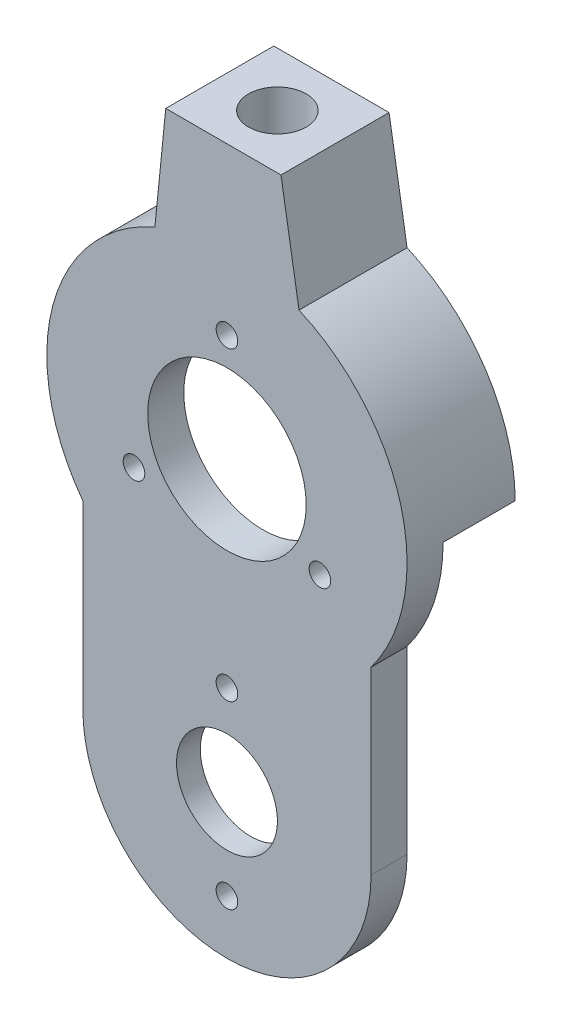
ISO-10303-21;
HEADER;
FILE_DESCRIPTION(('STEP AP214'),'2;1');
FILE_NAME('part.step','',(''),(''),'','','');
FILE_SCHEMA(('AUTOMOTIVE_DESIGN { 1 0 10303 214 1 1 1 1 }'));
ENDSEC;
DATA;
#1=APPLICATION_CONTEXT('core data for automotive mechanical design processes');
#2=APPLICATION_PROTOCOL_DEFINITION('international standard','automotive_design',2000,#1);
#3=PRODUCT_CONTEXT('',#1,'mechanical');
#4=PRODUCT('Part','Part','',(#3));
#5=PRODUCT_RELATED_PRODUCT_CATEGORY('part','',(#4));
#6=PRODUCT_DEFINITION_FORMATION('','',#4);
#7=PRODUCT_DEFINITION_CONTEXT('part definition',#1,'design');
#8=PRODUCT_DEFINITION('design','',#6,#7);
#9=PRODUCT_DEFINITION_SHAPE('','',#8);
#10=(LENGTH_UNIT() NAMED_UNIT(*) SI_UNIT(.MILLI.,.METRE.));
#11=(NAMED_UNIT(*) PLANE_ANGLE_UNIT() SI_UNIT($,.RADIAN.));
#12=(NAMED_UNIT(*) SI_UNIT($,.STERADIAN.) SOLID_ANGLE_UNIT());
#13=UNCERTAINTY_MEASURE_WITH_UNIT(LENGTH_MEASURE(1.E-05),#10,'distance_accuracy_value','');
#14=(GEOMETRIC_REPRESENTATION_CONTEXT(3) GLOBAL_UNCERTAINTY_ASSIGNED_CONTEXT((#13)) GLOBAL_UNIT_ASSIGNED_CONTEXT((#10,
#11,#12)) REPRESENTATION_CONTEXT('',''));
#15=CARTESIAN_POINT('',(0.,0.,0.));
#16=DIRECTION('',(0.,0.,1.));
#17=DIRECTION('',(1.,0.,0.));
#18=AXIS2_PLACEMENT_3D('',#15,#16,#17);
#19=CARTESIAN_POINT('',(0.,20.,5.));
#20=DIRECTION('',(0.,0.,-1.));
#21=DIRECTION('',(-1.,0.,0.));
#22=AXIS2_PLACEMENT_3D('',#19,#20,#21);
#23=CYLINDRICAL_SURFACE('',#22,25.);
#24=DIRECTION('',(0.,0.,-1.));
#25=VECTOR('',#24,1.);
#26=CARTESIAN_POINT('',(-10.,42.9128784747792,30.));
#27=LINE('',#26,#25);
#28=CARTESIAN_POINT('',(-10.,42.9128784747792,5.));
#29=VERTEX_POINT('',#28);
#30=CARTESIAN_POINT('',(-10.,42.9128784747792,-10.));
#31=VERTEX_POINT('',#30);
#32=EDGE_CURVE('E199',#29,#31,#27,.T.);
#33=ORIENTED_EDGE('',*,*,#32,.T.);
#34=CARTESIAN_POINT('',(0.,20.,-10.));
#35=DIRECTION('',(0.,0.,-1.));
#36=DIRECTION('',(-1.,0.,0.));
#37=AXIS2_PLACEMENT_3D('',#34,#35,#36);
#38=CIRCLE('',#37,25.);
#39=CARTESIAN_POINT('',(-25.,20.,-10.));
#40=VERTEX_POINT('',#39);
#41=EDGE_CURVE('E211',#40,#31,#38,.T.);
#42=ORIENTED_EDGE('',*,*,#41,.F.);
#43=DIRECTION('',(0.,0.,1.));
#44=VECTOR('',#43,1.);
#45=CARTESIAN_POINT('',(-25.,20.,-10.));
#46=LINE('',#45,#44);
#47=CARTESIAN_POINT('',(-25.,20.,0.));
#48=VERTEX_POINT('',#47);
#49=EDGE_CURVE('E228',#40,#48,#46,.T.);
#50=ORIENTED_EDGE('',*,*,#49,.T.);
#51=CARTESIAN_POINT('',(0.,20.,0.));
#52=DIRECTION('',(0.,0.,-1.));
#53=DIRECTION('',(-1.,0.,0.));
#54=AXIS2_PLACEMENT_3D('',#51,#52,#53);
#55=CIRCLE('',#54,25.);
#56=CARTESIAN_POINT('',(-20.,4.99999999999999,0.));
#57=VERTEX_POINT('',#56);
#58=EDGE_CURVE('E238',#57,#48,#55,.T.);
#59=ORIENTED_EDGE('',*,*,#58,.F.);
#60=DIRECTION('',(0.,0.,-1.));
#61=VECTOR('',#60,1.);
#62=CARTESIAN_POINT('',(-20.,4.99999999999999,5.));
#63=LINE('',#62,#61);
#64=CARTESIAN_POINT('',(-20.,4.99999999999999,5.));
#65=VERTEX_POINT('',#64);
#66=EDGE_CURVE('E236',#65,#57,#63,.T.);
#67=ORIENTED_EDGE('',*,*,#66,.F.);
#68=CARTESIAN_POINT('',(0.,20.,5.));
#69=DIRECTION('',(0.,0.,-1.));
#70=DIRECTION('',(-1.,0.,0.));
#71=AXIS2_PLACEMENT_3D('',#68,#69,#70);
#72=CIRCLE('',#71,25.);
#73=EDGE_CURVE('E91',#65,#29,#72,.T.);
#74=ORIENTED_EDGE('',*,*,#73,.T.);
#75=EDGE_LOOP('',(#33,#42,#50,#59,#67,#74));
#76=FACE_BOUND('',#75,.T.);
#77=ADVANCED_FACE('F74',(#76),#23,.T.);
#78=CARTESIAN_POINT('',(0.,0.,5.));
#79=DIRECTION('',(0.,0.,-1.));
#80=DIRECTION('',(-1.,0.,0.));
#81=AXIS2_PLACEMENT_3D('',#78,#79,#80);
#82=PLANE('',#81);
#83=CARTESIAN_POINT('',(10.,42.9128784747792,5.));
#84=VERTEX_POINT('',#83);
#85=CARTESIAN_POINT('',(20.,5.,5.));
#86=VERTEX_POINT('',#85);
#87=EDGE_CURVE('E237',#84,#86,#72,.T.);
#88=ORIENTED_EDGE('',*,*,#87,.F.);
#89=DIRECTION('',(-0.164398987305357,0.986393923832144,0.));
#90=VECTOR('',#89,1.);
#91=CARTESIAN_POINT('',(10.,42.9128784747792,5.));
#92=LINE('',#91,#90);
#93=CARTESIAN_POINT('',(7.50000000000001,57.9128784747792,5.));
#94=VERTEX_POINT('',#93);
#95=EDGE_CURVE('E202',#84,#94,#92,.T.);
#96=ORIENTED_EDGE('',*,*,#95,.T.);
#97=DIRECTION('',(-1.,0.,0.));
#98=VECTOR('',#97,1.);
#99=CARTESIAN_POINT('',(7.50000000000001,57.9128784747792,5.));
#100=LINE('',#99,#98);
#101=CARTESIAN_POINT('',(-8.49999999999999,57.9128784747792,5.));
#102=VERTEX_POINT('',#101);
#103=EDGE_CURVE('E173',#94,#102,#100,.T.);
#104=ORIENTED_EDGE('',*,*,#103,.T.);
#105=DIRECTION('',(-0.0995037190209996,-0.995037190209989,0.));
#106=VECTOR('',#105,1.);
#107=CARTESIAN_POINT('',(-8.49999999999999,57.9128784747792,5.));
#108=LINE('',#107,#106);
#109=EDGE_CURVE('E198',#102,#29,#108,.T.);
#110=ORIENTED_EDGE('',*,*,#109,.T.);
#111=ORIENTED_EDGE('',*,*,#73,.F.);
#112=DIRECTION('',(0.,-1.,0.));
#113=VECTOR('',#112,1.);
#114=CARTESIAN_POINT('',(-20.,-40.,5.));
#115=LINE('',#114,#113);
#116=CARTESIAN_POINT('',(-20.,-20.,5.));
#117=VERTEX_POINT('',#116);
#118=EDGE_CURVE('E12',#65,#117,#115,.T.);
#119=ORIENTED_EDGE('',*,*,#118,.T.);
#120=CARTESIAN_POINT('',(0.,-20.,5.));
#121=DIRECTION('',(0.,0.,-1.));
#122=DIRECTION('',(-1.,0.,0.));
#123=AXIS2_PLACEMENT_3D('',#120,#121,#122);
#124=CIRCLE('',#123,20.);
#125=CARTESIAN_POINT('',(20.,-20.,5.));
#126=VERTEX_POINT('',#125);
#127=EDGE_CURVE('E249',#126,#117,#124,.T.);
#128=ORIENTED_EDGE('',*,*,#127,.F.);
#129=DIRECTION('',(0.,1.,0.));
#130=VECTOR('',#129,1.);
#131=CARTESIAN_POINT('',(20.,-40.,5.));
#132=LINE('',#131,#130);
#133=EDGE_CURVE('E83',#126,#86,#132,.T.);
#134=ORIENTED_EDGE('',*,*,#133,.T.);
#135=EDGE_LOOP('',(#88,#96,#104,#110,#111,#119,#128,#134));
#136=FACE_BOUND('',#135,.T.);
#137=CARTESIAN_POINT('',(0.,-20.,5.));
#138=DIRECTION('',(0.,0.,-1.));
#139=DIRECTION('',(-1.,0.,0.));
#140=AXIS2_PLACEMENT_3D('',#137,#138,#139);
#141=CIRCLE('',#140,7.);
#142=CARTESIAN_POINT('',(-7.,-20.,5.));
#143=VERTEX_POINT('',#142);
#144=EDGE_CURVE('E258',#143,#143,#141,.T.);
#145=ORIENTED_EDGE('',*,*,#144,.T.);
#146=EDGE_LOOP('',(#145));
#147=FACE_BOUND('',#146,.T.);
#148=CARTESIAN_POINT('',(0.,-7.5,5.));
#149=DIRECTION('',(0.,0.,-1.));
#150=DIRECTION('',(-1.,0.,0.));
#151=AXIS2_PLACEMENT_3D('',#148,#149,#150);
#152=CIRCLE('',#151,1.5);
#153=CARTESIAN_POINT('',(-1.5,-7.5,5.));
#154=VERTEX_POINT('',#153);
#155=EDGE_CURVE('E273',#154,#154,#152,.F.);
#156=ORIENTED_EDGE('',*,*,#155,.F.);
#157=EDGE_LOOP('',(#156));
#158=FACE_BOUND('',#157,.T.);
#159=CARTESIAN_POINT('',(0.,-32.5,5.));
#160=DIRECTION('',(0.,0.,-1.));
#161=DIRECTION('',(-1.,0.,0.));
#162=AXIS2_PLACEMENT_3D('',#159,#160,#161);
#163=CIRCLE('',#162,1.5);
#164=CARTESIAN_POINT('',(-1.5,-32.5,5.));
#165=VERTEX_POINT('',#164);
#166=EDGE_CURVE('E272',#165,#165,#163,.F.);
#167=ORIENTED_EDGE('',*,*,#166,.F.);
#168=EDGE_LOOP('',(#167));
#169=FACE_BOUND('',#168,.T.);
#170=CARTESIAN_POINT('',(0.,34.9,5.));
#171=DIRECTION('',(0.,0.,-1.));
#172=DIRECTION('',(-1.,0.,0.));
#173=AXIS2_PLACEMENT_3D('',#170,#171,#172);
#174=CIRCLE('',#173,1.5);
#175=CARTESIAN_POINT('',(-1.5,34.9,5.));
#176=VERTEX_POINT('',#175);
#177=EDGE_CURVE('E282',#176,#176,#174,.F.);
#178=ORIENTED_EDGE('',*,*,#177,.F.);
#179=EDGE_LOOP('',(#178));
#180=FACE_BOUND('',#179,.T.);
#181=CARTESIAN_POINT('',(-12.9037785163881,12.5499999999999,5.));
#182=DIRECTION('',(0.,0.,-1.));
#183=DIRECTION('',(-1.,0.,0.));
#184=AXIS2_PLACEMENT_3D('',#181,#182,#183);
#185=CIRCLE('',#184,1.5);
#186=CARTESIAN_POINT('',(-14.4037785163881,12.5499999999999,5.));
#187=VERTEX_POINT('',#186);
#188=EDGE_CURVE('E287',#187,#187,#185,.F.);
#189=ORIENTED_EDGE('',*,*,#188,.F.);
#190=EDGE_LOOP('',(#189));
#191=FACE_BOUND('',#190,.T.);
#192=CARTESIAN_POINT('',(12.9037785163882,12.5500000000001,5.));
#193=DIRECTION('',(0.,0.,-1.));
#194=DIRECTION('',(-1.,0.,0.));
#195=AXIS2_PLACEMENT_3D('',#192,#193,#194);
#196=CIRCLE('',#195,1.5);
#197=CARTESIAN_POINT('',(11.4037785163882,12.5500000000001,5.));
#198=VERTEX_POINT('',#197);
#199=EDGE_CURVE('E276',#198,#198,#196,.F.);
#200=ORIENTED_EDGE('',*,*,#199,.F.);
#201=EDGE_LOOP('',(#200));
#202=FACE_BOUND('',#201,.T.);
#203=CARTESIAN_POINT('',(0.,20.,5.));
#204=DIRECTION('',(0.,0.,1.));
#205=DIRECTION('',(1.,0.,0.));
#206=AXIS2_PLACEMENT_3D('',#203,#204,#205);
#207=CIRCLE('',#206,11.);
#208=CARTESIAN_POINT('',(11.,20.,5.));
#209=VERTEX_POINT('',#208);
#210=EDGE_CURVE('E286',#209,#209,#207,.T.);
#211=ORIENTED_EDGE('',*,*,#210,.F.);
#212=EDGE_LOOP('',(#211));
#213=FACE_BOUND('',#212,.T.);
#214=ADVANCED_FACE('F324',(#136,#147,#158,#169,#180,#191,#202,#213),#82,.F.);
#215=CARTESIAN_POINT('',(0.,0.,0.));
#216=DIRECTION('',(0.,0.,-1.));
#217=DIRECTION('',(-1.,0.,0.));
#218=AXIS2_PLACEMENT_3D('',#215,#216,#217);
#219=PLANE('',#218);
#220=DIRECTION('',(-1.,0.,0.));
#221=VECTOR('',#220,1.);
#222=CARTESIAN_POINT('',(20.,20.,0.));
#223=LINE('',#222,#221);
#224=CARTESIAN_POINT('',(25.,20.,0.));
#225=VERTEX_POINT('',#224);
#226=CARTESIAN_POINT('',(20.,20.,0.));
#227=VERTEX_POINT('',#226);
#228=EDGE_CURVE('E209',#225,#227,#223,.T.);
#229=ORIENTED_EDGE('',*,*,#228,.F.);
#230=CARTESIAN_POINT('',(20.,5.,0.));
#231=VERTEX_POINT('',#230);
#232=EDGE_CURVE('E234',#225,#231,#55,.T.);
#233=ORIENTED_EDGE('',*,*,#232,.T.);
#234=DIRECTION('',(0.,1.,0.));
#235=VECTOR('',#234,1.);
#236=CARTESIAN_POINT('',(20.,-40.,0.));
#237=LINE('',#236,#235);
#238=CARTESIAN_POINT('',(20.,-20.,0.));
#239=VERTEX_POINT('',#238);
#240=EDGE_CURVE('E302',#239,#231,#237,.T.);
#241=ORIENTED_EDGE('',*,*,#240,.F.);
#242=CARTESIAN_POINT('',(0.,-20.,0.));
#243=DIRECTION('',(0.,0.,-1.));
#244=DIRECTION('',(-1.,0.,0.));
#245=AXIS2_PLACEMENT_3D('',#242,#243,#244);
#246=CIRCLE('',#245,20.);
#247=CARTESIAN_POINT('',(-20.,-20.,0.));
#248=VERTEX_POINT('',#247);
#249=EDGE_CURVE('E248',#239,#248,#246,.T.);
#250=ORIENTED_EDGE('',*,*,#249,.T.);
#251=DIRECTION('',(0.,-1.,0.));
#252=VECTOR('',#251,1.);
#253=CARTESIAN_POINT('',(-20.,-40.,0.));
#254=LINE('',#253,#252);
#255=EDGE_CURVE('E304',#57,#248,#254,.T.);
#256=ORIENTED_EDGE('',*,*,#255,.F.);
#257=ORIENTED_EDGE('',*,*,#58,.T.);
#258=DIRECTION('',(-1.,0.,0.));
#259=VECTOR('',#258,1.);
#260=CARTESIAN_POINT('',(-20.,20.,0.));
#261=LINE('',#260,#259);
#262=CARTESIAN_POINT('',(-20.,20.,0.));
#263=VERTEX_POINT('',#262);
#264=EDGE_CURVE('E218',#263,#48,#261,.T.);
#265=ORIENTED_EDGE('',*,*,#264,.F.);
#266=CARTESIAN_POINT('',(0.,20.,0.));
#267=DIRECTION('',(0.,0.,1.));
#268=DIRECTION('',(-1.,0.,0.));
#269=AXIS2_PLACEMENT_3D('',#266,#267,#268);
#270=CIRCLE('',#269,20.);
#271=EDGE_CURVE('E204',#227,#263,#270,.T.);
#272=ORIENTED_EDGE('',*,*,#271,.F.);
#273=EDGE_LOOP('',(#229,#233,#241,#250,#256,#257,#265,#272));
#274=FACE_BOUND('',#273,.T.);
#275=CARTESIAN_POINT('',(0.,-20.,0.));
#276=DIRECTION('',(0.,0.,-1.));
#277=DIRECTION('',(-1.,0.,0.));
#278=AXIS2_PLACEMENT_3D('',#275,#276,#277);
#279=CIRCLE('',#278,19.);
#280=CARTESIAN_POINT('',(-19.,-20.,0.));
#281=VERTEX_POINT('',#280);
#282=EDGE_CURVE('E261',#281,#281,#279,.T.);
#283=ORIENTED_EDGE('',*,*,#282,.F.);
#284=EDGE_LOOP('',(#283));
#285=FACE_BOUND('',#284,.T.);
#286=CARTESIAN_POINT('',(0.,34.9,0.));
#287=DIRECTION('',(0.,0.,-1.));
#288=DIRECTION('',(-1.,0.,0.));
#289=AXIS2_PLACEMENT_3D('',#286,#287,#288);
#290=CIRCLE('',#289,1.5);
#291=CARTESIAN_POINT('',(-1.5,34.9,0.));
#292=VERTEX_POINT('',#291);
#293=EDGE_CURVE('E279',#292,#292,#290,.T.);
#294=ORIENTED_EDGE('',*,*,#293,.F.);
#295=EDGE_LOOP('',(#294));
#296=FACE_BOUND('',#295,.T.);
#297=CARTESIAN_POINT('',(-12.9037785163881,12.5499999999999,0.));
#298=DIRECTION('',(0.,0.,-1.));
#299=DIRECTION('',(-1.,0.,0.));
#300=AXIS2_PLACEMENT_3D('',#297,#298,#299);
#301=CIRCLE('',#300,1.5);
#302=CARTESIAN_POINT('',(-14.4037785163881,12.5499999999999,0.));
#303=VERTEX_POINT('',#302);
#304=EDGE_CURVE('E283',#303,#303,#301,.T.);
#305=ORIENTED_EDGE('',*,*,#304,.F.);
#306=EDGE_LOOP('',(#305));
#307=FACE_BOUND('',#306,.T.);
#308=CARTESIAN_POINT('',(12.9037785163882,12.5500000000001,0.));
#309=DIRECTION('',(0.,0.,-1.));
#310=DIRECTION('',(-1.,0.,0.));
#311=AXIS2_PLACEMENT_3D('',#308,#309,#310);
#312=CIRCLE('',#311,1.5);
#313=CARTESIAN_POINT('',(11.4037785163882,12.5500000000001,0.));
#314=VERTEX_POINT('',#313);
#315=EDGE_CURVE('E290',#314,#314,#312,.T.);
#316=ORIENTED_EDGE('',*,*,#315,.F.);
#317=EDGE_LOOP('',(#316));
#318=FACE_BOUND('',#317,.T.);
#319=CARTESIAN_POINT('',(0.,20.,0.));
#320=DIRECTION('',(0.,0.,-1.));
#321=DIRECTION('',(-1.,0.,0.));
#322=AXIS2_PLACEMENT_3D('',#319,#320,#321);
#323=CIRCLE('',#322,11.);
#324=CARTESIAN_POINT('',(11.,20.,0.));
#325=VERTEX_POINT('',#324);
#326=EDGE_CURVE('E299',#325,#325,#323,.F.);
#327=ORIENTED_EDGE('',*,*,#326,.T.);
#328=EDGE_LOOP('',(#327));
#329=FACE_BOUND('',#328,.T.);
#330=ADVANCED_FACE('F317',(#274,#285,#296,#307,#318,#329),#219,.T.);
#331=CARTESIAN_POINT('',(20.,-40.,5.));
#332=DIRECTION('',(-1.,0.,0.));
#333=DIRECTION('',(0.,0.,1.));
#334=AXIS2_PLACEMENT_3D('',#331,#332,#333);
#335=PLANE('',#334);
#336=ORIENTED_EDGE('',*,*,#240,.T.);
#337=DIRECTION('',(0.,0.,-1.));
#338=VECTOR('',#337,1.);
#339=CARTESIAN_POINT('',(20.,5.,5.));
#340=LINE('',#339,#338);
#341=EDGE_CURVE('E240',#86,#231,#340,.T.);
#342=ORIENTED_EDGE('',*,*,#341,.F.);
#343=ORIENTED_EDGE('',*,*,#133,.F.);
#344=DIRECTION('',(0.,0.,-1.));
#345=VECTOR('',#344,1.);
#346=CARTESIAN_POINT('',(20.,-20.,5.));
#347=LINE('',#346,#345);
#348=EDGE_CURVE('E243',#126,#239,#347,.T.);
#349=ORIENTED_EDGE('',*,*,#348,.T.);
#350=EDGE_LOOP('',(#336,#342,#343,#349));
#351=FACE_BOUND('',#350,.T.);
#352=ADVANCED_FACE('F76',(#351),#335,.F.);
#353=CARTESIAN_POINT('',(-20.,-40.,5.));
#354=DIRECTION('',(1.,0.,0.));
#355=DIRECTION('',(0.,0.,-1.));
#356=AXIS2_PLACEMENT_3D('',#353,#354,#355);
#357=PLANE('',#356);
#358=ORIENTED_EDGE('',*,*,#118,.F.);
#359=ORIENTED_EDGE('',*,*,#66,.T.);
#360=ORIENTED_EDGE('',*,*,#255,.T.);
#361=DIRECTION('',(0.,0.,-1.));
#362=VECTOR('',#361,1.);
#363=CARTESIAN_POINT('',(-20.,-20.,5.));
#364=LINE('',#363,#362);
#365=EDGE_CURVE('E252',#117,#248,#364,.T.);
#366=ORIENTED_EDGE('',*,*,#365,.F.);
#367=EDGE_LOOP('',(#358,#359,#360,#366));
#368=FACE_BOUND('',#367,.T.);
#369=ADVANCED_FACE('F311',(#368),#357,.F.);
#370=CARTESIAN_POINT('',(0.,-32.5,9.24264068711929));
#371=DIRECTION('',(0.,0.,-1.));
#372=DIRECTION('',(-1.,0.,0.));
#373=AXIS2_PLACEMENT_3D('',#370,#371,#372);
#374=CYLINDRICAL_SURFACE('',#373,1.5);
#375=ORIENTED_EDGE('',*,*,#166,.T.);
#376=EDGE_LOOP('',(#375));
#377=FACE_BOUND('',#376,.T.);
#378=CARTESIAN_POINT('',(0.,-32.5,1.7));
#379=DIRECTION('',(0.,0.,-1.));
#380=DIRECTION('',(-1.,0.,0.));
#381=AXIS2_PLACEMENT_3D('',#378,#379,#380);
#382=CIRCLE('',#381,1.5);
#383=CARTESIAN_POINT('',(-1.5,-32.5,1.7));
#384=VERTEX_POINT('',#383);
#385=EDGE_CURVE('E269',#384,#384,#382,.F.);
#386=ORIENTED_EDGE('',*,*,#385,.F.);
#387=EDGE_LOOP('',(#386));
#388=FACE_BOUND('',#387,.T.);
#389=ADVANCED_FACE('F365',(#377,#388),#374,.F.);
#390=CARTESIAN_POINT('',(0.,-7.5,9.24264068711929));
#391=DIRECTION('',(0.,0.,-1.));
#392=DIRECTION('',(-1.,0.,0.));
#393=AXIS2_PLACEMENT_3D('',#390,#391,#392);
#394=CYLINDRICAL_SURFACE('',#393,1.5);
#395=ORIENTED_EDGE('',*,*,#155,.T.);
#396=EDGE_LOOP('',(#395));
#397=FACE_BOUND('',#396,.T.);
#398=CARTESIAN_POINT('',(0.,-7.5,1.7));
#399=DIRECTION('',(0.,0.,-1.));
#400=DIRECTION('',(-1.,0.,0.));
#401=AXIS2_PLACEMENT_3D('',#398,#399,#400);
#402=CIRCLE('',#401,1.5);
#403=CARTESIAN_POINT('',(-1.5,-7.5,1.7));
#404=VERTEX_POINT('',#403);
#405=EDGE_CURVE('E78',#404,#404,#402,.F.);
#406=ORIENTED_EDGE('',*,*,#405,.F.);
#407=EDGE_LOOP('',(#406));
#408=FACE_BOUND('',#407,.T.);
#409=ADVANCED_FACE('F371',(#397,#408),#394,.F.);
#410=CARTESIAN_POINT('',(0.,20.,-31.1126983722081));
#411=DIRECTION('',(0.,0.,1.));
#412=DIRECTION('',(1.,0.,0.));
#413=AXIS2_PLACEMENT_3D('',#410,#411,#412);
#414=CYLINDRICAL_SURFACE('',#413,11.);
#415=CARTESIAN_POINT('',(11.,20.,5.));
#416=CARTESIAN_POINT('',(11.,20.,4.94791666666667));
#417=CARTESIAN_POINT('',(11.,20.,4.89583333333334));
#418=CARTESIAN_POINT('',(11.,20.,4.79166666666667));
#419=CARTESIAN_POINT('',(11.,20.,4.73958333333333));
#420=CARTESIAN_POINT('',(11.,20.,4.63541666666667));
#421=CARTESIAN_POINT('',(11.,20.,4.58333333333333));
#422=CARTESIAN_POINT('',(11.,20.,4.47916666666667));
#423=CARTESIAN_POINT('',(11.,20.,4.42708333333333));
#424=CARTESIAN_POINT('',(11.,20.,4.32291666666667));
#425=CARTESIAN_POINT('',(11.,20.,4.27083333333334));
#426=CARTESIAN_POINT('',(11.,20.,4.16666666666667));
#427=CARTESIAN_POINT('',(11.,20.,4.11458333333333));
#428=CARTESIAN_POINT('',(11.,20.,4.01041666666667));
#429=CARTESIAN_POINT('',(11.,20.,3.95833333333333));
#430=CARTESIAN_POINT('',(11.,20.,3.85416666666666));
#431=CARTESIAN_POINT('',(11.,20.,3.80208333333333));
#432=CARTESIAN_POINT('',(11.,20.,3.69791666666667));
#433=CARTESIAN_POINT('',(11.,20.,3.64583333333334));
#434=CARTESIAN_POINT('',(11.,20.,3.54166666666667));
#435=CARTESIAN_POINT('',(11.,20.,3.48958333333333));
#436=CARTESIAN_POINT('',(11.,20.,3.38541666666667));
#437=CARTESIAN_POINT('',(11.,20.,3.33333333333333));
#438=CARTESIAN_POINT('',(11.,20.,3.22916666666666));
#439=CARTESIAN_POINT('',(11.,20.,3.17708333333333));
#440=CARTESIAN_POINT('',(11.,20.,3.07291666666667));
#441=CARTESIAN_POINT('',(11.,20.,3.02083333333333));
#442=CARTESIAN_POINT('',(11.,20.,2.91666666666667));
#443=CARTESIAN_POINT('',(11.,20.,2.86458333333333));
#444=CARTESIAN_POINT('',(11.,20.,2.76041666666666));
#445=CARTESIAN_POINT('',(11.,20.,2.70833333333333));
#446=CARTESIAN_POINT('',(11.,20.,2.60416666666666));
#447=CARTESIAN_POINT('',(11.,20.,2.55208333333333));
#448=CARTESIAN_POINT('',(11.,20.,2.44791666666667));
#449=CARTESIAN_POINT('',(11.,20.,2.39583333333333));
#450=CARTESIAN_POINT('',(11.,20.,2.29166666666667));
#451=CARTESIAN_POINT('',(11.,20.,2.23958333333333));
#452=CARTESIAN_POINT('',(11.,20.,2.13541666666666));
#453=CARTESIAN_POINT('',(11.,20.,2.08333333333333));
#454=CARTESIAN_POINT('',(11.,20.,1.97916666666666));
#455=CARTESIAN_POINT('',(11.,20.,1.92708333333333));
#456=CARTESIAN_POINT('',(11.,20.,1.82291666666667));
#457=CARTESIAN_POINT('',(11.,20.,1.77083333333333));
#458=CARTESIAN_POINT('',(11.,20.,1.66666666666667));
#459=CARTESIAN_POINT('',(11.,20.,1.61458333333333));
#460=CARTESIAN_POINT('',(11.,20.,1.51041666666666));
#461=CARTESIAN_POINT('',(11.,20.,1.45833333333333));
#462=CARTESIAN_POINT('',(11.,20.,1.35416666666666));
#463=CARTESIAN_POINT('',(11.,20.,1.30208333333333));
#464=CARTESIAN_POINT('',(11.,20.,1.19791666666667));
#465=CARTESIAN_POINT('',(11.,20.,1.14583333333333));
#466=CARTESIAN_POINT('',(11.,20.,1.04166666666667));
#467=CARTESIAN_POINT('',(11.,20.,0.989583333333332));
#468=CARTESIAN_POINT('',(11.,20.,0.885416666666663));
#469=CARTESIAN_POINT('',(11.,20.,0.833333333333328));
#470=CARTESIAN_POINT('',(11.,20.,0.729166666666662));
#471=CARTESIAN_POINT('',(11.,20.,0.677083333333329));
#472=CARTESIAN_POINT('',(11.,20.,0.572916666666665));
#473=CARTESIAN_POINT('',(11.,20.,0.520833333333333));
#474=CARTESIAN_POINT('',(11.,20.,0.416666666666666));
#475=CARTESIAN_POINT('',(11.,20.,0.364583333333331));
#476=CARTESIAN_POINT('',(11.,20.,0.260416666666662));
#477=CARTESIAN_POINT('',(11.,20.,0.208333333333328));
#478=CARTESIAN_POINT('',(11.,20.,0.104166666666662));
#479=CARTESIAN_POINT('',(11.,20.,0.0520833333333311));
#480=CARTESIAN_POINT('',(11.,20.,0.));
#481=B_SPLINE_CURVE_WITH_KNOTS('',3,(#415,#416,#417,#418,#419,#420,#421,#422,#423,#424,#425,
#426,#427,#428,#429,#430,#431,#432,#433,#434,#435,#436,#437,#438,#439,#440,#441,#442,#443,#444,
#445,#446,#447,#448,#449,#450,#451,#452,#453,#454,#455,#456,#457,#458,#459,#460,#461,#462,#463,
#464,#465,#466,#467,#468,#469,#470,#471,#472,#473,#474,#475,#476,#477,#478,#479,#480),
.UNSPECIFIED.,.F.,.F.,(4,2,2,2,2,2,2,2,2,2,2,2,2,2,2,2,2,2,2,2,2,2,2,2,2,2,2,2,2,2,2,2,4),(0.,
0.156249999999997,0.3125,0.468750000000004,0.625000000000001,0.781249999999997,
0.937500000000001,1.09375,1.25,1.40625,1.5625,1.71875,1.875,2.03125,2.1875,2.34375000000001,2.5,
2.65625,2.8125,2.96875000000001,3.125,3.28125,3.4375,3.59375000000001,3.75,3.90625,4.0625,
4.21875000000001,4.375,4.53125,4.6875,4.84375000000001,5.),.UNSPECIFIED.);
#482=EDGE_CURVE('BSEAM362',#209,#325,#481,.T.);
#483=ORIENTED_EDGE('',*,*,#210,.T.);
#484=ORIENTED_EDGE('',*,*,#326,.F.);
#485=ORIENTED_EDGE('',*,*,#482,.T.);
#486=ORIENTED_EDGE('',*,*,#482,.F.);
#487=EDGE_LOOP('',(#483,#485,#484,#486));
#488=FACE_BOUND('',#487,.T.);
#489=ADVANCED_FACE('F362',(#488),#414,.F.);
#490=CARTESIAN_POINT('',(12.9037785163882,12.5500000000001,9.24264068711929));
#491=DIRECTION('',(0.,0.,-1.));
#492=DIRECTION('',(-1.,0.,0.));
#493=AXIS2_PLACEMENT_3D('',#490,#491,#492);
#494=CYLINDRICAL_SURFACE('',#493,1.5);
#495=ORIENTED_EDGE('',*,*,#199,.T.);
#496=EDGE_LOOP('',(#495));
#497=FACE_BOUND('',#496,.T.);
#498=ORIENTED_EDGE('',*,*,#315,.T.);
#499=EDGE_LOOP('',(#498));
#500=FACE_BOUND('',#499,.T.);
#501=ADVANCED_FACE('F454',(#497,#500),#494,.F.);
#502=CARTESIAN_POINT('',(-12.9037785163881,12.5499999999999,9.24264068711929));
#503=DIRECTION('',(0.,0.,-1.));
#504=DIRECTION('',(-1.,0.,0.));
#505=AXIS2_PLACEMENT_3D('',#502,#503,#504);
#506=CYLINDRICAL_SURFACE('',#505,1.5);
#507=ORIENTED_EDGE('',*,*,#188,.T.);
#508=EDGE_LOOP('',(#507));
#509=FACE_BOUND('',#508,.T.);
#510=ORIENTED_EDGE('',*,*,#304,.T.);
#511=EDGE_LOOP('',(#510));
#512=FACE_BOUND('',#511,.T.);
#513=ADVANCED_FACE('F444',(#509,#512),#506,.F.);
#514=CARTESIAN_POINT('',(0.,34.9,9.24264068711929));
#515=DIRECTION('',(0.,0.,-1.));
#516=DIRECTION('',(-1.,0.,0.));
#517=AXIS2_PLACEMENT_3D('',#514,#515,#516);
#518=CYLINDRICAL_SURFACE('',#517,1.5);
#519=ORIENTED_EDGE('',*,*,#177,.T.);
#520=EDGE_LOOP('',(#519));
#521=FACE_BOUND('',#520,.T.);
#522=ORIENTED_EDGE('',*,*,#293,.T.);
#523=EDGE_LOOP('',(#522));
#524=FACE_BOUND('',#523,.T.);
#525=ADVANCED_FACE('F407',(#521,#524),#518,.F.);
#526=CARTESIAN_POINT('',(0.,-20.,1.7));
#527=DIRECTION('',(0.,0.,-1.));
#528=DIRECTION('',(-1.,0.,0.));
#529=AXIS2_PLACEMENT_3D('',#526,#527,#528);
#530=PLANE('',#529);
#531=CARTESIAN_POINT('',(0.,-20.,1.7));
#532=DIRECTION('',(0.,0.,-1.));
#533=DIRECTION('',(-1.,0.,0.));
#534=AXIS2_PLACEMENT_3D('',#531,#532,#533);
#535=CIRCLE('',#534,7.);
#536=CARTESIAN_POINT('',(-7.,-20.,1.7));
#537=VERTEX_POINT('',#536);
#538=EDGE_CURVE('E257',#537,#537,#535,.T.);
#539=ORIENTED_EDGE('',*,*,#538,.F.);
#540=EDGE_LOOP('',(#539));
#541=FACE_BOUND('',#540,.T.);
#542=CARTESIAN_POINT('',(0.,-20.,1.7));
#543=DIRECTION('',(0.,0.,-1.));
#544=DIRECTION('',(-1.,0.,0.));
#545=AXIS2_PLACEMENT_3D('',#542,#543,#544);
#546=CIRCLE('',#545,19.);
#547=CARTESIAN_POINT('',(-19.,-20.,1.7));
#548=VERTEX_POINT('',#547);
#549=EDGE_CURVE('E264',#548,#548,#546,.T.);
#550=ORIENTED_EDGE('',*,*,#549,.T.);
#551=EDGE_LOOP('',(#550));
#552=FACE_BOUND('',#551,.T.);
#553=ORIENTED_EDGE('',*,*,#405,.T.);
#554=EDGE_LOOP('',(#553));
#555=FACE_BOUND('',#554,.T.);
#556=ORIENTED_EDGE('',*,*,#385,.T.);
#557=EDGE_LOOP('',(#556));
#558=FACE_BOUND('',#557,.T.);
#559=ADVANCED_FACE('F402',(#541,#552,#555,#558),#530,.T.);
#560=CARTESIAN_POINT('',(0.,-20.,1.7));
#561=DIRECTION('',(0.,0.,-1.));
#562=DIRECTION('',(-1.,0.,0.));
#563=AXIS2_PLACEMENT_3D('',#560,#561,#562);
#564=CYLINDRICAL_SURFACE('',#563,19.);
#565=ORIENTED_EDGE('',*,*,#549,.F.);
#566=EDGE_LOOP('',(#565));
#567=FACE_BOUND('',#566,.T.);
#568=ORIENTED_EDGE('',*,*,#282,.T.);
#569=EDGE_LOOP('',(#568));
#570=FACE_BOUND('',#569,.T.);
#571=ADVANCED_FACE('F392',(#567,#570),#564,.F.);
#572=CARTESIAN_POINT('',(0.,-20.,5.));
#573=DIRECTION('',(0.,0.,-1.));
#574=DIRECTION('',(-1.,0.,0.));
#575=AXIS2_PLACEMENT_3D('',#572,#573,#574);
#576=CYLINDRICAL_SURFACE('',#575,7.);
#577=ORIENTED_EDGE('',*,*,#144,.F.);
#578=EDGE_LOOP('',(#577));
#579=FACE_BOUND('',#578,.T.);
#580=ORIENTED_EDGE('',*,*,#538,.T.);
#581=EDGE_LOOP('',(#580));
#582=FACE_BOUND('',#581,.T.);
#583=ADVANCED_FACE('F351',(#579,#582),#576,.F.);
#584=CARTESIAN_POINT('',(0.,-20.,5.));
#585=DIRECTION('',(0.,0.,-1.));
#586=DIRECTION('',(-1.,0.,0.));
#587=AXIS2_PLACEMENT_3D('',#584,#585,#586);
#588=CYLINDRICAL_SURFACE('',#587,20.);
#589=ORIENTED_EDGE('',*,*,#249,.F.);
#590=ORIENTED_EDGE('',*,*,#348,.F.);
#591=ORIENTED_EDGE('',*,*,#127,.T.);
#592=ORIENTED_EDGE('',*,*,#365,.T.);
#593=EDGE_LOOP('',(#589,#590,#591,#592));
#594=FACE_BOUND('',#593,.T.);
#595=ADVANCED_FACE('F314',(#594),#588,.T.);
#596=DIRECTION('',(0.,0.,-1.));
#597=VECTOR('',#596,1.);
#598=CARTESIAN_POINT('',(10.,42.9128784747792,30.));
#599=LINE('',#598,#597);
#600=CARTESIAN_POINT('',(10.,42.9128784747792,-10.));
#601=VERTEX_POINT('',#600);
#602=EDGE_CURVE('E176',#84,#601,#599,.T.);
#603=ORIENTED_EDGE('',*,*,#602,.F.);
#604=ORIENTED_EDGE('',*,*,#87,.T.);
#605=ORIENTED_EDGE('',*,*,#341,.T.);
#606=ORIENTED_EDGE('',*,*,#232,.F.);
#607=DIRECTION('',(0.,0.,1.));
#608=VECTOR('',#607,1.);
#609=CARTESIAN_POINT('',(25.,20.,-10.));
#610=LINE('',#609,#608);
#611=CARTESIAN_POINT('',(25.,20.,-10.));
#612=VERTEX_POINT('',#611);
#613=EDGE_CURVE('E225',#612,#225,#610,.T.);
#614=ORIENTED_EDGE('',*,*,#613,.F.);
#615=EDGE_CURVE('E99',#601,#612,#38,.T.);
#616=ORIENTED_EDGE('',*,*,#615,.F.);
#617=EDGE_LOOP('',(#603,#604,#605,#606,#614,#616));
#618=FACE_BOUND('',#617,.T.);
#619=ADVANCED_FACE('F342',(#618),#23,.T.);
#620=CARTESIAN_POINT('',(0.,20.,-10.));
#621=DIRECTION('',(0.,0.,1.));
#622=DIRECTION('',(1.,0.,0.));
#623=AXIS2_PLACEMENT_3D('',#620,#621,#622);
#624=CYLINDRICAL_SURFACE('',#623,20.);
#625=ORIENTED_EDGE('',*,*,#271,.T.);
#626=DIRECTION('',(0.,0.,1.));
#627=VECTOR('',#626,1.);
#628=CARTESIAN_POINT('',(-20.,20.,-10.));
#629=LINE('',#628,#627);
#630=CARTESIAN_POINT('',(-20.,20.,-10.));
#631=VERTEX_POINT('',#630);
#632=EDGE_CURVE('E231',#631,#263,#629,.T.);
#633=ORIENTED_EDGE('',*,*,#632,.F.);
#634=CARTESIAN_POINT('',(0.,20.,-10.));
#635=DIRECTION('',(0.,0.,1.));
#636=DIRECTION('',(-1.,0.,0.));
#637=AXIS2_PLACEMENT_3D('',#634,#635,#636);
#638=CIRCLE('',#637,20.);
#639=CARTESIAN_POINT('',(20.,20.,-10.));
#640=VERTEX_POINT('',#639);
#641=EDGE_CURVE('E205',#640,#631,#638,.T.);
#642=ORIENTED_EDGE('',*,*,#641,.F.);
#643=DIRECTION('',(0.,0.,1.));
#644=VECTOR('',#643,1.);
#645=CARTESIAN_POINT('',(20.,20.,-10.));
#646=LINE('',#645,#644);
#647=EDGE_CURVE('E215',#640,#227,#646,.T.);
#648=ORIENTED_EDGE('',*,*,#647,.T.);
#649=EDGE_LOOP('',(#625,#633,#642,#648));
#650=FACE_BOUND('',#649,.T.);
#651=ADVANCED_FACE('F337',(#650),#624,.F.);
#652=CARTESIAN_POINT('',(-20.,20.,-10.));
#653=DIRECTION('',(0.,1.,0.));
#654=DIRECTION('',(0.,0.,1.));
#655=AXIS2_PLACEMENT_3D('',#652,#653,#654);
#656=PLANE('',#655);
#657=ORIENTED_EDGE('',*,*,#264,.T.);
#658=ORIENTED_EDGE('',*,*,#49,.F.);
#659=DIRECTION('',(-1.,0.,0.));
#660=VECTOR('',#659,1.);
#661=CARTESIAN_POINT('',(-20.,20.,-10.));
#662=LINE('',#661,#660);
#663=EDGE_CURVE('E208',#631,#40,#662,.T.);
#664=ORIENTED_EDGE('',*,*,#663,.F.);
#665=ORIENTED_EDGE('',*,*,#632,.T.);
#666=EDGE_LOOP('',(#657,#658,#664,#665));
#667=FACE_BOUND('',#666,.T.);
#668=ADVANCED_FACE('F335',(#667),#656,.F.);
#669=CARTESIAN_POINT('',(20.,20.,-10.));
#670=DIRECTION('',(0.,1.,0.));
#671=DIRECTION('',(0.,0.,1.));
#672=AXIS2_PLACEMENT_3D('',#669,#670,#671);
#673=PLANE('',#672);
#674=ORIENTED_EDGE('',*,*,#228,.T.);
#675=ORIENTED_EDGE('',*,*,#647,.F.);
#676=DIRECTION('',(-1.,0.,0.));
#677=VECTOR('',#676,1.);
#678=CARTESIAN_POINT('',(20.,20.,-10.));
#679=LINE('',#678,#677);
#680=EDGE_CURVE('E213',#612,#640,#679,.T.);
#681=ORIENTED_EDGE('',*,*,#680,.F.);
#682=ORIENTED_EDGE('',*,*,#613,.T.);
#683=EDGE_LOOP('',(#674,#675,#681,#682));
#684=FACE_BOUND('',#683,.T.);
#685=ADVANCED_FACE('F341',(#684),#673,.F.);
#686=CARTESIAN_POINT('',(0.,20.,-10.));
#687=DIRECTION('',(0.,0.,-1.));
#688=DIRECTION('',(-1.,0.,0.));
#689=AXIS2_PLACEMENT_3D('',#686,#687,#688);
#690=PLANE('',#689);
#691=ORIENTED_EDGE('',*,*,#41,.T.);
#692=DIRECTION('',(0.0995037190209996,0.995037190209989,0.));
#693=VECTOR('',#692,1.);
#694=CARTESIAN_POINT('',(-8.49999999999999,57.9128784747792,-10.));
#695=LINE('',#694,#693);
#696=CARTESIAN_POINT('',(-8.49999999999999,57.9128784747792,-10.));
#697=VERTEX_POINT('',#696);
#698=EDGE_CURVE('E177',#31,#697,#695,.T.);
#699=ORIENTED_EDGE('',*,*,#698,.T.);
#700=DIRECTION('',(1.,0.,0.));
#701=VECTOR('',#700,1.);
#702=CARTESIAN_POINT('',(7.50000000000001,57.9128784747792,-10.));
#703=LINE('',#702,#701);
#704=CARTESIAN_POINT('',(7.50000000000001,57.9128784747792,-10.));
#705=VERTEX_POINT('',#704);
#706=EDGE_CURVE('E171',#697,#705,#703,.T.);
#707=ORIENTED_EDGE('',*,*,#706,.T.);
#708=DIRECTION('',(0.164398987305357,-0.986393923832144,0.));
#709=VECTOR('',#708,1.);
#710=CARTESIAN_POINT('',(10.,42.9128784747792,-10.));
#711=LINE('',#710,#709);
#712=EDGE_CURVE('E180',#705,#601,#711,.T.);
#713=ORIENTED_EDGE('',*,*,#712,.T.);
#714=ORIENTED_EDGE('',*,*,#615,.T.);
#715=ORIENTED_EDGE('',*,*,#680,.T.);
#716=ORIENTED_EDGE('',*,*,#641,.T.);
#717=ORIENTED_EDGE('',*,*,#663,.T.);
#718=EDGE_LOOP('',(#691,#699,#707,#713,#714,#715,#716,#717));
#719=FACE_BOUND('',#718,.T.);
#720=ADVANCED_FACE('F185',(#719),#690,.T.);
#721=CARTESIAN_POINT('',(7.50000000000001,57.9128784747792,30.));
#722=DIRECTION('',(0.,1.,0.));
#723=DIRECTION('',(0.,0.,1.));
#724=AXIS2_PLACEMENT_3D('',#721,#722,#723);
#725=PLANE('',#724);
#726=CARTESIAN_POINT('',(-0.499999999999995,57.9128784747792,-2.5));
#727=DIRECTION('',(0.,1.,0.));
#728=DIRECTION('',(0.,0.,1.));
#729=AXIS2_PLACEMENT_3D('',#726,#727,#728);
#730=CIRCLE('',#729,4.);
#731=CARTESIAN_POINT('',(-0.499999999999995,57.9128784747792,1.5));
#732=VERTEX_POINT('',#731);
#733=EDGE_CURVE('E190',#732,#732,#730,.T.);
#734=ORIENTED_EDGE('',*,*,#733,.F.);
#735=EDGE_LOOP('',(#734));
#736=FACE_BOUND('',#735,.T.);
#737=ORIENTED_EDGE('',*,*,#103,.F.);
#738=DIRECTION('',(0.,0.,-1.));
#739=VECTOR('',#738,1.);
#740=CARTESIAN_POINT('',(7.50000000000001,57.9128784747792,30.));
#741=LINE('',#740,#739);
#742=EDGE_CURVE('E166',#94,#705,#741,.T.);
#743=ORIENTED_EDGE('',*,*,#742,.T.);
#744=ORIENTED_EDGE('',*,*,#706,.F.);
#745=DIRECTION('',(0.,0.,-1.));
#746=VECTOR('',#745,1.);
#747=CARTESIAN_POINT('',(-8.49999999999999,57.9128784747792,30.));
#748=LINE('',#747,#746);
#749=EDGE_CURVE('E196',#102,#697,#748,.T.);
#750=ORIENTED_EDGE('',*,*,#749,.F.);
#751=EDGE_LOOP('',(#737,#743,#744,#750));
#752=FACE_BOUND('',#751,.T.);
#753=ADVANCED_FACE('F168',(#736,#752),#725,.T.);
#754=CARTESIAN_POINT('',(-8.49999999999999,57.9128784747792,30.));
#755=DIRECTION('',(-0.995037190209989,0.0995037190209996,0.));
#756=DIRECTION('',(-0.0995037190209996,-0.995037190209989,0.));
#757=AXIS2_PLACEMENT_3D('',#754,#755,#756);
#758=PLANE('',#757);
#759=ORIENTED_EDGE('',*,*,#109,.F.);
#760=ORIENTED_EDGE('',*,*,#749,.T.);
#761=ORIENTED_EDGE('',*,*,#698,.F.);
#762=ORIENTED_EDGE('',*,*,#32,.F.);
#763=EDGE_LOOP('',(#759,#760,#761,#762));
#764=FACE_BOUND('',#763,.T.);
#765=ADVANCED_FACE('F329',(#764),#758,.T.);
#766=CARTESIAN_POINT('',(10.,42.9128784747792,30.));
#767=DIRECTION('',(0.986393923832144,0.164398987305357,0.));
#768=DIRECTION('',(-0.164398987305357,0.986393923832144,0.));
#769=AXIS2_PLACEMENT_3D('',#766,#767,#768);
#770=PLANE('',#769);
#771=ORIENTED_EDGE('',*,*,#95,.F.);
#772=ORIENTED_EDGE('',*,*,#602,.T.);
#773=ORIENTED_EDGE('',*,*,#712,.F.);
#774=ORIENTED_EDGE('',*,*,#742,.F.);
#775=EDGE_LOOP('',(#771,#772,#773,#774));
#776=FACE_BOUND('',#775,.T.);
#777=ADVANCED_FACE('F181',(#776),#770,.T.);
#778=CARTESIAN_POINT('',(-0.499999999999995,42.9128784747792,-2.5));
#779=DIRECTION('',(0.,1.,0.));
#780=DIRECTION('',(0.,0.,1.));
#781=AXIS2_PLACEMENT_3D('',#778,#779,#780);
#782=CYLINDRICAL_SURFACE('',#781,4.);
#783=CARTESIAN_POINT('',(-0.499999999999995,42.9128784747792,-2.5));
#784=DIRECTION('',(0.,1.,0.));
#785=DIRECTION('',(0.,0.,1.));
#786=AXIS2_PLACEMENT_3D('',#783,#784,#785);
#787=CIRCLE('',#786,4.);
#788=CARTESIAN_POINT('',(-0.499999999999995,42.9128784747792,1.5));
#789=VERTEX_POINT('',#788);
#790=EDGE_CURVE('E187',#789,#789,#787,.T.);
#791=ORIENTED_EDGE('',*,*,#790,.F.);
#792=EDGE_LOOP('',(#791));
#793=FACE_BOUND('',#792,.T.);
#794=ORIENTED_EDGE('',*,*,#733,.T.);
#795=EDGE_LOOP('',(#794));
#796=FACE_BOUND('',#795,.T.);
#797=ADVANCED_FACE('F600',(#793,#796),#782,.F.);
#798=CARTESIAN_POINT('',(-0.499999999999995,42.9128784747792,-2.5));
#799=DIRECTION('',(0.,1.,0.));
#800=DIRECTION('',(0.,0.,1.));
#801=AXIS2_PLACEMENT_3D('',#798,#799,#800);
#802=PLANE('',#801);
#803=ORIENTED_EDGE('',*,*,#790,.T.);
#804=EDGE_LOOP('',(#803));
#805=FACE_BOUND('',#804,.T.);
#806=ADVANCED_FACE('F606',(#805),#802,.T.);
#807=CLOSED_SHELL('',(#77,#214,#330,#352,#369,#389,#409,#489,#501,#513,#525,#559,#571,#583,#595,
#619,#651,#668,#685,#720,#753,#765,#777,#797,#806));
#808=MANIFOLD_SOLID_BREP('B2',#807);
#809=ADVANCED_BREP_SHAPE_REPRESENTATION('',(#18,#808),#14);
#810=SHAPE_DEFINITION_REPRESENTATION(#9,#809);
ENDSEC;
END-ISO-10303-21;
